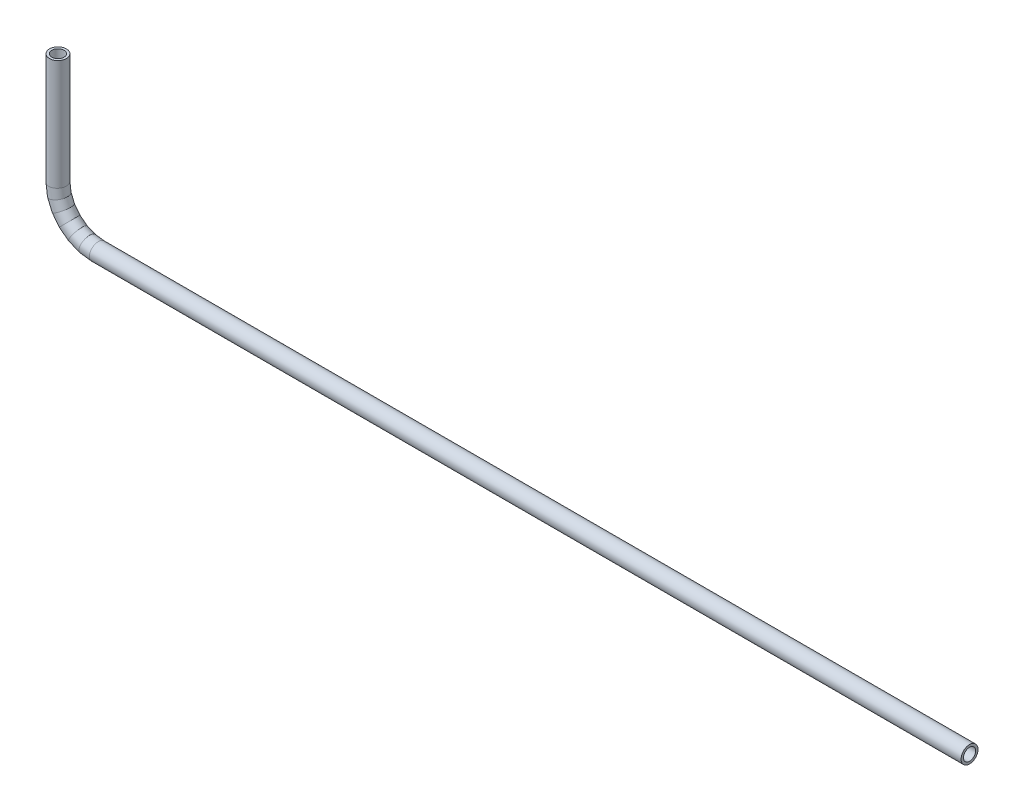
ISO-10303-21;
HEADER;
FILE_DESCRIPTION(('STEP AP214'),'2;1');
FILE_NAME('part.step','',(''),(''),'','','');
FILE_SCHEMA(('AUTOMOTIVE_DESIGN { 1 0 10303 214 1 1 1 1 }'));
ENDSEC;
DATA;
#1=APPLICATION_CONTEXT('core data for automotive mechanical design processes');
#2=APPLICATION_PROTOCOL_DEFINITION('international standard','automotive_design',2000,#1);
#3=PRODUCT_CONTEXT('',#1,'mechanical');
#4=PRODUCT('Part','Part','',(#3));
#5=PRODUCT_RELATED_PRODUCT_CATEGORY('part','',(#4));
#6=PRODUCT_DEFINITION_FORMATION('','',#4);
#7=PRODUCT_DEFINITION_CONTEXT('part definition',#1,'design');
#8=PRODUCT_DEFINITION('design','',#6,#7);
#9=PRODUCT_DEFINITION_SHAPE('','',#8);
#10=(LENGTH_UNIT() NAMED_UNIT(*) SI_UNIT(.MILLI.,.METRE.));
#11=(NAMED_UNIT(*) PLANE_ANGLE_UNIT() SI_UNIT($,.RADIAN.));
#12=(NAMED_UNIT(*) SI_UNIT($,.STERADIAN.) SOLID_ANGLE_UNIT());
#13=UNCERTAINTY_MEASURE_WITH_UNIT(LENGTH_MEASURE(1.E-05),#10,'distance_accuracy_value','');
#14=(GEOMETRIC_REPRESENTATION_CONTEXT(3) GLOBAL_UNCERTAINTY_ASSIGNED_CONTEXT((#13)) GLOBAL_UNIT_ASSIGNED_CONTEXT((#10,
#11,#12)) REPRESENTATION_CONTEXT('',''));
#15=CARTESIAN_POINT('',(0.,0.,0.));
#16=DIRECTION('',(0.,0.,1.));
#17=DIRECTION('',(1.,0.,0.));
#18=AXIS2_PLACEMENT_3D('',#15,#16,#17);
#19=CARTESIAN_POINT('',(-3704.19277838077,-73.5578210877641,0.));
#20=DIRECTION('',(0.,1.,0.));
#21=DIRECTION('',(0.,0.,1.));
#22=AXIS2_PLACEMENT_3D('',#19,#20,#21);
#23=CYLINDRICAL_SURFACE('',#22,3.175);
#24=CARTESIAN_POINT('',(-3704.19277838077,-72.9999999999999,0.));
#25=DIRECTION('',(-0.065403129230125,0.997858923238605,0.));
#26=DIRECTION('',(-0.997858923238605,-0.065403129230125,0.));
#27=AXIS2_PLACEMENT_3D('',#24,#25,#26);
#28=ELLIPSE('',#27,3.18181250481317,3.175);
#29=CARTESIAN_POINT('',(-3707.36777838077,-73.2081004944383,0.));
#30=VERTEX_POINT('',#29);
#31=EDGE_CURVE('E45',#30,#30,#28,.T.);
#32=ORIENTED_EDGE('',*,*,#31,.T.);
#33=EDGE_LOOP('',(#32));
#34=FACE_BOUND('',#33,.T.);
#35=CARTESIAN_POINT('',(-3704.19277838077,-31.2999999999999,0.));
#36=DIRECTION('',(0.,-1.,0.));
#37=DIRECTION('',(0.,0.,-1.));
#38=AXIS2_PLACEMENT_3D('',#35,#36,#37);
#39=CIRCLE('',#38,3.175);
#40=CARTESIAN_POINT('',(-3704.19277838077,-31.2999999999999,-3.175));
#41=VERTEX_POINT('',#40);
#42=EDGE_CURVE('E80',#41,#41,#39,.T.);
#43=ORIENTED_EDGE('',*,*,#42,.T.);
#44=EDGE_LOOP('',(#43));
#45=FACE_BOUND('',#44,.T.);
#46=ADVANCED_FACE('F39',(#34,#45),#23,.T.);
#47=CARTESIAN_POINT('',(-3703.54858222293,-77.8931556153322,0.));
#48=DIRECTION('',(-0.130526192220016,0.991444861373815,0.));
#49=DIRECTION('',(-0.991444861373815,-0.130526192220016,0.));
#50=AXIS2_PLACEMENT_3D('',#47,#48,#49);
#51=CYLINDRICAL_SURFACE('',#50,3.175);
#52=CARTESIAN_POINT('',(-3703.68166577511,-76.8822856765376,0.));
#53=DIRECTION('',(-0.258819045102501,0.965925826289074,0.));
#54=DIRECTION('',(-0.965925826289074,-0.258819045102501,0.));
#55=AXIS2_PLACEMENT_3D('',#52,#53,#54);
#56=ELLIPSE('',#55,3.20239694984199,3.175);
#57=CARTESIAN_POINT('',(-3706.77494369499,-77.7111269971349,0.));
#58=VERTEX_POINT('',#57);
#59=EDGE_CURVE('E94',#58,#58,#56,.T.);
#60=ORIENTED_EDGE('',*,*,#59,.T.);
#61=EDGE_LOOP('',(#60));
#62=FACE_BOUND('',#61,.T.);
#63=ORIENTED_EDGE('',*,*,#31,.F.);
#64=EDGE_LOOP('',(#63));
#65=FACE_BOUND('',#64,.T.);
#66=ADVANCED_FACE('F103',(#62,#65),#51,.T.);
#67=CARTESIAN_POINT('',(-3701.79297820516,-81.4419808230076,0.));
#68=DIRECTION('',(-0.382683432365085,0.923879532511289,0.));
#69=DIRECTION('',(-0.923879532511289,-0.382683432365085,0.));
#70=AXIS2_PLACEMENT_3D('',#67,#68,#69);
#71=CYLINDRICAL_SURFACE('',#70,3.175);
#72=CARTESIAN_POINT('',(-3702.18315943754,-80.5000000000001,0.));
#73=DIRECTION('',(-0.500000000000009,0.866025403784433,0.));
#74=DIRECTION('',(-0.866025403784433,-0.500000000000009,0.));
#75=AXIS2_PLACEMENT_3D('',#72,#73,#74);
#76=ELLIPSE('',#75,3.20239694984199,3.175);
#77=CARTESIAN_POINT('',(-3704.95651654911,-82.1011984749212,0.));
#78=VERTEX_POINT('',#77);
#79=EDGE_CURVE('E95',#78,#78,#76,.T.);
#80=ORIENTED_EDGE('',*,*,#79,.T.);
#81=EDGE_LOOP('',(#80));
#82=FACE_BOUND('',#81,.T.);
#83=ORIENTED_EDGE('',*,*,#59,.F.);
#84=EDGE_LOOP('',(#83));
#85=FACE_BOUND('',#84,.T.);
#86=ADVANCED_FACE('F104',(#82,#85),#71,.T.);
#87=CARTESIAN_POINT('',(-3699.17869139216,-84.4154989886272,0.));
#88=DIRECTION('',(-0.608761429008742,0.793353340291219,0.));
#89=DIRECTION('',(-0.793353340291219,-0.608761429008742,0.));
#90=AXIS2_PLACEMENT_3D('',#87,#88,#89);
#91=CYLINDRICAL_SURFACE('',#90,3.175);
#92=CARTESIAN_POINT('',(-3699.79938009857,-83.6066017177983,0.));
#93=DIRECTION('',(-0.70710678118655,0.707106781186545,0.));
#94=DIRECTION('',(-0.707106781186545,-0.70710678118655,0.));
#95=AXIS2_PLACEMENT_3D('',#92,#93,#94);
#96=ELLIPSE('',#95,3.20239694984198,3.175);
#97=CARTESIAN_POINT('',(-3702.06381669786,-85.8710383170827,0.));
#98=VERTEX_POINT('',#97);
#99=EDGE_CURVE('E90',#98,#98,#96,.T.);
#100=ORIENTED_EDGE('',*,*,#99,.T.);
#101=EDGE_LOOP('',(#100));
#102=FACE_BOUND('',#101,.T.);
#103=ORIENTED_EDGE('',*,*,#79,.F.);
#104=EDGE_LOOP('',(#103));
#105=FACE_BOUND('',#104,.T.);
#106=ADVANCED_FACE('F109',(#102,#105),#91,.T.);
#107=CARTESIAN_POINT('',(-3695.88388110995,-86.6110697631763,0.));
#108=DIRECTION('',(-0.793353340291223,0.608761429008737,0.));
#109=DIRECTION('',(-0.608761429008737,-0.793353340291223,0.));
#110=AXIS2_PLACEMENT_3D('',#107,#108,#109);
#111=CYLINDRICAL_SURFACE('',#110,3.175);
#112=CARTESIAN_POINT('',(-3696.69277838077,-85.9903810567664,0.));
#113=DIRECTION('',(-0.866025403784438,0.500000000000001,0.));
#114=DIRECTION('',(-0.500000000000001,-0.866025403784438,0.));
#115=AXIS2_PLACEMENT_3D('',#112,#113,#114);
#116=ELLIPSE('',#115,3.20239694984199,3.175);
#117=CARTESIAN_POINT('',(-3698.2939768557,-88.7637381683314,0.));
#118=VERTEX_POINT('',#117);
#119=EDGE_CURVE('E88',#118,#118,#116,.T.);
#120=ORIENTED_EDGE('',*,*,#119,.T.);
#121=EDGE_LOOP('',(#120));
#122=FACE_BOUND('',#121,.T.);
#123=ORIENTED_EDGE('',*,*,#99,.F.);
#124=EDGE_LOOP('',(#123));
#125=FACE_BOUND('',#124,.T.);
#126=ADVANCED_FACE('F169',(#122,#125),#111,.T.);
#127=CARTESIAN_POINT('',(-3692.13308323431,-87.8790686267208,0.));
#128=DIRECTION('',(-0.923879532511294,0.382683432365073,0.));
#129=DIRECTION('',(-0.382683432365073,-0.923879532511294,0.));
#130=AXIS2_PLACEMENT_3D('',#127,#128,#129);
#131=CYLINDRICAL_SURFACE('',#130,3.175);
#132=CARTESIAN_POINT('',(-3693.07506405731,-87.488887394336,0.));
#133=DIRECTION('',(-0.965925826289069,0.258819045102517,0.));
#134=DIRECTION('',(-0.258819045102517,-0.965925826289069,0.));
#135=AXIS2_PLACEMENT_3D('',#132,#133,#134);
#136=ELLIPSE('',#135,3.20239694984198,3.175);
#137=CARTESIAN_POINT('',(-3693.90390537791,-90.5821653142177,0.));
#138=VERTEX_POINT('',#137);
#139=EDGE_CURVE('E85',#138,#138,#136,.T.);
#140=ORIENTED_EDGE('',*,*,#139,.T.);
#141=EDGE_LOOP('',(#140));
#142=FACE_BOUND('',#141,.T.);
#143=ORIENTED_EDGE('',*,*,#119,.F.);
#144=EDGE_LOOP('',(#143));
#145=FACE_BOUND('',#144,.T.);
#146=ADVANCED_FACE('F163',(#142,#145),#131,.T.);
#147=CARTESIAN_POINT('',(-3688.63972952974,-88.0728102625259,0.));
#148=DIRECTION('',(-0.991444861373809,0.130526192220062,0.));
#149=DIRECTION('',(-0.130526192220062,-0.991444861373809,0.));
#150=AXIS2_PLACEMENT_3D('',#147,#148,#149);
#151=CYLINDRICAL_SURFACE('',#150,3.175);
#152=CARTESIAN_POINT('',(-3689.19277838077,-88.,0.));
#153=DIRECTION('',(-0.997858923238603,0.0654031292301481,0.));
#154=DIRECTION('',(-0.0654031292301481,-0.997858923238603,0.));
#155=AXIS2_PLACEMENT_3D('',#152,#153,#154);
#156=ELLIPSE('',#155,3.18181250481318,3.175);
#157=CARTESIAN_POINT('',(-3689.40087887521,-91.175,0.));
#158=VERTEX_POINT('',#157);
#159=EDGE_CURVE('E78',#158,#158,#156,.T.);
#160=ORIENTED_EDGE('',*,*,#159,.T.);
#161=EDGE_LOOP('',(#160));
#162=FACE_BOUND('',#161,.T.);
#163=ORIENTED_EDGE('',*,*,#139,.F.);
#164=EDGE_LOOP('',(#163));
#165=FACE_BOUND('',#164,.T.);
#166=ADVANCED_FACE('F159',(#162,#165),#151,.T.);
#167=CARTESIAN_POINT('',(-3361.64277838077,-88.,0.));
#168=DIRECTION('',(-1.,0.,0.));
#169=DIRECTION('',(0.,0.,1.));
#170=AXIS2_PLACEMENT_3D('',#167,#168,#169);
#171=CYLINDRICAL_SURFACE('',#170,3.175);
#172=CARTESIAN_POINT('',(-3361.64277838077,-88.,0.));
#173=DIRECTION('',(1.,0.,0.));
#174=DIRECTION('',(0.,0.,-1.));
#175=AXIS2_PLACEMENT_3D('',#172,#173,#174);
#176=CIRCLE('',#175,3.175);
#177=CARTESIAN_POINT('',(-3361.64277838077,-88.,-3.17499999999999));
#178=VERTEX_POINT('',#177);
#179=EDGE_CURVE('E74',#178,#178,#176,.T.);
#180=ORIENTED_EDGE('',*,*,#179,.F.);
#181=EDGE_LOOP('',(#180));
#182=FACE_BOUND('',#181,.T.);
#183=ORIENTED_EDGE('',*,*,#159,.F.);
#184=EDGE_LOOP('',(#183));
#185=FACE_BOUND('',#184,.T.);
#186=ADVANCED_FACE('F156',(#182,#185),#171,.T.);
#187=CARTESIAN_POINT('',(-3704.19277838077,-31.2999999999999,0.));
#188=DIRECTION('',(0.,-1.,0.));
#189=DIRECTION('',(0.,0.,-1.));
#190=AXIS2_PLACEMENT_3D('',#187,#188,#189);
#191=PLANE('',#190);
#192=CARTESIAN_POINT('',(-3704.19277838077,-31.2999999999999,0.));
#193=DIRECTION('',(0.,-1.,0.));
#194=DIRECTION('',(0.,0.,-1.));
#195=AXIS2_PLACEMENT_3D('',#192,#193,#194);
#196=CIRCLE('',#195,2.286);
#197=CARTESIAN_POINT('',(-3704.19277838077,-31.2999999999999,-2.286));
#198=VERTEX_POINT('',#197);
#199=EDGE_CURVE('E72',#198,#198,#196,.F.);
#200=ORIENTED_EDGE('',*,*,#199,.F.);
#201=EDGE_LOOP('',(#200));
#202=FACE_BOUND('',#201,.T.);
#203=ORIENTED_EDGE('',*,*,#42,.F.);
#204=EDGE_LOOP('',(#203));
#205=FACE_BOUND('',#204,.T.);
#206=ADVANCED_FACE('F155',(#202,#205),#191,.F.);
#207=CARTESIAN_POINT('',(-3361.64277838077,-88.,0.));
#208=DIRECTION('',(1.,0.,0.));
#209=DIRECTION('',(0.,0.,-1.));
#210=AXIS2_PLACEMENT_3D('',#207,#208,#209);
#211=PLANE('',#210);
#212=CARTESIAN_POINT('',(-3361.64277838077,-88.,0.));
#213=DIRECTION('',(1.,0.,0.));
#214=DIRECTION('',(0.,0.,-1.));
#215=AXIS2_PLACEMENT_3D('',#212,#213,#214);
#216=CIRCLE('',#215,2.286);
#217=CARTESIAN_POINT('',(-3361.64277838077,-88.,-2.28599999999999));
#218=VERTEX_POINT('',#217);
#219=EDGE_CURVE('E46',#218,#218,#216,.F.);
#220=ORIENTED_EDGE('',*,*,#219,.T.);
#221=EDGE_LOOP('',(#220));
#222=FACE_BOUND('',#221,.T.);
#223=ORIENTED_EDGE('',*,*,#179,.T.);
#224=EDGE_LOOP('',(#223));
#225=FACE_BOUND('',#224,.T.);
#226=ADVANCED_FACE('F146',(#222,#225),#211,.T.);
#227=CARTESIAN_POINT('',(-3704.19277838077,-73.4296311831901,0.));
#228=DIRECTION('',(0.,1.,0.));
#229=DIRECTION('',(0.,0.,1.));
#230=AXIS2_PLACEMENT_3D('',#227,#228,#229);
#231=CYLINDRICAL_SURFACE('',#230,2.286);
#232=CARTESIAN_POINT('',(-3704.19277838077,-72.9999999999999,0.));
#233=DIRECTION('',(-0.065403129230125,0.997858923238605,0.));
#234=DIRECTION('',(-0.997858923238605,-0.065403129230125,0.));
#235=AXIS2_PLACEMENT_3D('',#232,#233,#234);
#236=ELLIPSE('',#235,2.29090500346548,2.286);
#237=CARTESIAN_POINT('',(-3706.47877838077,-73.1498323559955,0.));
#238=VERTEX_POINT('',#237);
#239=EDGE_CURVE('E70',#238,#238,#236,.F.);
#240=ORIENTED_EDGE('',*,*,#239,.T.);
#241=EDGE_LOOP('',(#240));
#242=FACE_BOUND('',#241,.T.);
#243=ORIENTED_EDGE('',*,*,#199,.T.);
#244=EDGE_LOOP('',(#243));
#245=FACE_BOUND('',#244,.T.);
#246=ADVANCED_FACE('F145',(#242,#245),#231,.F.);
#247=CARTESIAN_POINT('',(-3703.58219088416,-77.6378724885882,0.));
#248=DIRECTION('',(-0.130526192220016,0.991444861373815,0.));
#249=DIRECTION('',(-0.991444861373815,-0.130526192220016,0.));
#250=AXIS2_PLACEMENT_3D('',#247,#248,#249);
#251=CYLINDRICAL_SURFACE('',#250,2.286);
#252=CARTESIAN_POINT('',(-3703.68166577511,-76.8822856765377,0.));
#253=DIRECTION('',(-0.258819045102501,0.965925826289074,0.));
#254=DIRECTION('',(-0.965925826289074,-0.258819045102501,0.));
#255=AXIS2_PLACEMENT_3D('',#252,#253,#254);
#256=ELLIPSE('',#255,2.30572580388623,2.286);
#257=CARTESIAN_POINT('',(-3705.90882587742,-77.4790514273678,0.));
#258=VERTEX_POINT('',#257);
#259=EDGE_CURVE('E63',#258,#258,#256,.F.);
#260=ORIENTED_EDGE('',*,*,#259,.T.);
#261=EDGE_LOOP('',(#260));
#262=FACE_BOUND('',#261,.T.);
#263=ORIENTED_EDGE('',*,*,#239,.F.);
#264=EDGE_LOOP('',(#263));
#265=FACE_BOUND('',#264,.T.);
#266=ADVANCED_FACE('F138',(#262,#265),#251,.F.);
#267=CARTESIAN_POINT('',(-3701.89151381412,-81.2040948194759,0.));
#268=DIRECTION('',(-0.382683432365085,0.923879532511289,0.));
#269=DIRECTION('',(-0.923879532511289,-0.382683432365085,0.));
#270=AXIS2_PLACEMENT_3D('',#267,#268,#269);
#271=CYLINDRICAL_SURFACE('',#270,2.286);
#272=CARTESIAN_POINT('',(-3702.18315943754,-80.5000000000001,0.));
#273=DIRECTION('',(-0.500000000000009,0.866025403784433,0.));
#274=DIRECTION('',(-0.866025403784433,-0.50000000000001,0.));
#275=AXIS2_PLACEMENT_3D('',#272,#273,#274);
#276=ELLIPSE('',#275,2.30572580388623,2.286);
#277=CARTESIAN_POINT('',(-3704.17997655787,-81.6528629019433,0.));
#278=VERTEX_POINT('',#277);
#279=EDGE_CURVE('E65',#278,#278,#276,.F.);
#280=ORIENTED_EDGE('',*,*,#279,.T.);
#281=EDGE_LOOP('',(#280));
#282=FACE_BOUND('',#281,.T.);
#283=ORIENTED_EDGE('',*,*,#259,.F.);
#284=EDGE_LOOP('',(#283));
#285=FACE_BOUND('',#284,.T.);
#286=ADVANCED_FACE('F137',(#282,#285),#271,.F.);
#287=CARTESIAN_POINT('',(-3699.33543890995,-84.2112216463233,0.));
#288=DIRECTION('',(-0.608761429008742,0.793353340291219,0.));
#289=DIRECTION('',(-0.793353340291219,-0.608761429008742,0.));
#290=AXIS2_PLACEMENT_3D('',#287,#288,#289);
#291=CYLINDRICAL_SURFACE('',#290,2.286);
#292=CARTESIAN_POINT('',(-3699.79938009857,-83.6066017177981,0.));
#293=DIRECTION('',(-0.70710678118655,0.707106781186545,0.));
#294=DIRECTION('',(-0.707106781186545,-0.70710678118655,0.));
#295=AXIS2_PLACEMENT_3D('',#292,#293,#294);
#296=ELLIPSE('',#295,2.30572580388622,2.286);
#297=CARTESIAN_POINT('',(-3701.42977445006,-85.2369960692828,0.));
#298=VERTEX_POINT('',#297);
#299=EDGE_CURVE('E56',#298,#298,#296,.F.);
#300=ORIENTED_EDGE('',*,*,#299,.T.);
#301=EDGE_LOOP('',(#300));
#302=FACE_BOUND('',#301,.T.);
#303=ORIENTED_EDGE('',*,*,#279,.F.);
#304=EDGE_LOOP('',(#303));
#305=FACE_BOUND('',#304,.T.);
#306=ADVANCED_FACE('F135',(#302,#305),#291,.F.);
#307=CARTESIAN_POINT('',(-3696.08815845225,-86.4543222453935,0.));
#308=DIRECTION('',(-0.793353340291223,0.608761429008737,0.));
#309=DIRECTION('',(-0.608761429008737,-0.793353340291223,0.));
#310=AXIS2_PLACEMENT_3D('',#307,#308,#309);
#311=CYLINDRICAL_SURFACE('',#310,2.286);
#312=CARTESIAN_POINT('',(-3696.69277838077,-85.9903810567664,0.));
#313=DIRECTION('',(-0.866025403784438,0.500000000000001,0.));
#314=DIRECTION('',(-0.500000000000001,-0.866025403784438,0.));
#315=AXIS2_PLACEMENT_3D('',#312,#313,#314);
#316=ELLIPSE('',#315,2.30572580388623,2.286);
#317=CARTESIAN_POINT('',(-3697.84564128272,-87.9871981770932,0.));
#318=VERTEX_POINT('',#317);
#319=EDGE_CURVE('E57',#318,#318,#316,.F.);
#320=ORIENTED_EDGE('',*,*,#319,.T.);
#321=EDGE_LOOP('',(#320));
#322=FACE_BOUND('',#321,.T.);
#323=ORIENTED_EDGE('',*,*,#299,.F.);
#324=EDGE_LOOP('',(#323));
#325=FACE_BOUND('',#324,.T.);
#326=ADVANCED_FACE('F126',(#322,#325),#311,.F.);
#327=CARTESIAN_POINT('',(-3692.37096923784,-87.7805330177592,0.));
#328=DIRECTION('',(-0.923879532511294,0.382683432365073,0.));
#329=DIRECTION('',(-0.382683432365073,-0.923879532511294,0.));
#330=AXIS2_PLACEMENT_3D('',#327,#328,#329);
#331=CYLINDRICAL_SURFACE('',#330,2.286);
#332=CARTESIAN_POINT('',(-3693.07506405731,-87.488887394336,0.));
#333=DIRECTION('',(-0.965925826289069,0.258819045102517,0.));
#334=DIRECTION('',(-0.258819045102517,-0.965925826289069,0.));
#335=AXIS2_PLACEMENT_3D('',#332,#333,#334);
#336=ELLIPSE('',#335,2.30572580388622,2.286);
#337=CARTESIAN_POINT('',(-3693.67182980814,-89.7160474966508,0.));
#338=VERTEX_POINT('',#337);
#339=EDGE_CURVE('E51',#338,#338,#336,.F.);
#340=ORIENTED_EDGE('',*,*,#339,.T.);
#341=EDGE_LOOP('',(#340));
#342=FACE_BOUND('',#341,.T.);
#343=ORIENTED_EDGE('',*,*,#319,.F.);
#344=EDGE_LOOP('',(#343));
#345=FACE_BOUND('',#344,.T.);
#346=ADVANCED_FACE('F122',(#342,#345),#331,.F.);
#347=CARTESIAN_POINT('',(-3688.76682275191,-88.0560781224008,0.));
#348=DIRECTION('',(-0.991444861373809,0.130526192220062,0.));
#349=DIRECTION('',(-0.130526192220062,-0.991444861373809,0.));
#350=AXIS2_PLACEMENT_3D('',#347,#348,#349);
#351=CYLINDRICAL_SURFACE('',#350,2.286);
#352=CARTESIAN_POINT('',(-3689.19277838077,-88.,0.));
#353=DIRECTION('',(-0.997858923238603,0.0654031292301481,0.));
#354=DIRECTION('',(-0.0654031292301481,-0.997858923238603,0.));
#355=AXIS2_PLACEMENT_3D('',#352,#353,#354);
#356=ELLIPSE('',#355,2.29090500346549,2.286);
#357=CARTESIAN_POINT('',(-3689.34261073677,-90.286,0.));
#358=VERTEX_POINT('',#357);
#359=EDGE_CURVE('E10',#358,#358,#356,.F.);
#360=ORIENTED_EDGE('',*,*,#359,.T.);
#361=EDGE_LOOP('',(#360));
#362=FACE_BOUND('',#361,.T.);
#363=ORIENTED_EDGE('',*,*,#339,.F.);
#364=EDGE_LOOP('',(#363));
#365=FACE_BOUND('',#364,.T.);
#366=ADVANCED_FACE('F113',(#362,#365),#351,.F.);
#367=CARTESIAN_POINT('',(-3361.64277838077,-88.,0.));
#368=DIRECTION('',(-1.,0.,0.));
#369=DIRECTION('',(0.,0.,1.));
#370=AXIS2_PLACEMENT_3D('',#367,#368,#369);
#371=CYLINDRICAL_SURFACE('',#370,2.286);
#372=ORIENTED_EDGE('',*,*,#219,.F.);
#373=EDGE_LOOP('',(#372));
#374=FACE_BOUND('',#373,.T.);
#375=ORIENTED_EDGE('',*,*,#359,.F.);
#376=EDGE_LOOP('',(#375));
#377=FACE_BOUND('',#376,.T.);
#378=ADVANCED_FACE('F114',(#374,#377),#371,.F.);
#379=CLOSED_SHELL('',(#46,#66,#86,#106,#126,#146,#166,#186,#206,#226,#246,#266,#286,#306,#326,
#346,#366,#378));
#380=MANIFOLD_SOLID_BREP('B2',#379);
#381=ADVANCED_BREP_SHAPE_REPRESENTATION('',(#18,#380),#14);
#382=SHAPE_DEFINITION_REPRESENTATION(#9,#381);
ENDSEC;
END-ISO-10303-21;
